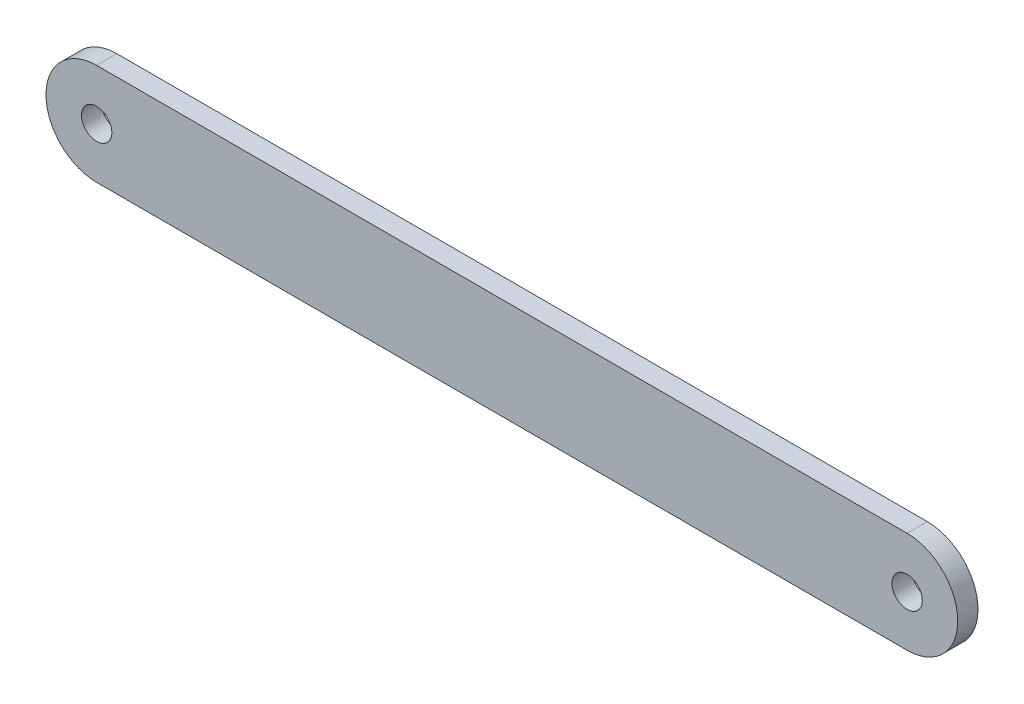
ISO-10303-21;
HEADER;
FILE_DESCRIPTION(('STEP AP214'),'2;1');
FILE_NAME('part.step','',(''),(''),'','','');
FILE_SCHEMA(('AUTOMOTIVE_DESIGN { 1 0 10303 214 1 1 1 1 }'));
ENDSEC;
DATA;
#1=APPLICATION_CONTEXT('core data for automotive mechanical design processes');
#2=APPLICATION_PROTOCOL_DEFINITION('international standard','automotive_design',2000,#1);
#3=PRODUCT_CONTEXT('',#1,'mechanical');
#4=PRODUCT('Part','Part','',(#3));
#5=PRODUCT_RELATED_PRODUCT_CATEGORY('part','',(#4));
#6=PRODUCT_DEFINITION_FORMATION('','',#4);
#7=PRODUCT_DEFINITION_CONTEXT('part definition',#1,'design');
#8=PRODUCT_DEFINITION('design','',#6,#7);
#9=PRODUCT_DEFINITION_SHAPE('','',#8);
#10=(LENGTH_UNIT() NAMED_UNIT(*) SI_UNIT(.MILLI.,.METRE.));
#11=(NAMED_UNIT(*) PLANE_ANGLE_UNIT() SI_UNIT($,.RADIAN.));
#12=(NAMED_UNIT(*) SI_UNIT($,.STERADIAN.) SOLID_ANGLE_UNIT());
#13=UNCERTAINTY_MEASURE_WITH_UNIT(LENGTH_MEASURE(1.E-05),#10,'distance_accuracy_value','');
#14=(GEOMETRIC_REPRESENTATION_CONTEXT(3) GLOBAL_UNCERTAINTY_ASSIGNED_CONTEXT((#13)) GLOBAL_UNIT_ASSIGNED_CONTEXT((#10,
#11,#12)) REPRESENTATION_CONTEXT('',''));
#15=CARTESIAN_POINT('',(0.,0.,0.));
#16=DIRECTION('',(0.,0.,1.));
#17=DIRECTION('',(1.,0.,0.));
#18=AXIS2_PLACEMENT_3D('',#15,#16,#17);
#19=CARTESIAN_POINT('',(-40.,0.,2.));
#20=DIRECTION('',(0.,0.,1.));
#21=DIRECTION('',(1.,0.,0.));
#22=AXIS2_PLACEMENT_3D('',#19,#20,#21);
#23=PLANE('',#22);
#24=CARTESIAN_POINT('',(-40.,0.,2.));
#25=DIRECTION('',(0.,0.,1.));
#26=DIRECTION('',(1.,0.,0.));
#27=AXIS2_PLACEMENT_3D('',#24,#25,#26);
#28=CIRCLE('',#27,1.5);
#29=CARTESIAN_POINT('',(-38.5,0.,2.));
#30=VERTEX_POINT('',#29);
#31=EDGE_CURVE('E99',#30,#30,#28,.T.);
#32=ORIENTED_EDGE('',*,*,#31,.F.);
#33=EDGE_LOOP('',(#32));
#34=FACE_BOUND('',#33,.T.);
#35=CARTESIAN_POINT('',(-40.,0.,2.));
#36=DIRECTION('',(0.,0.,1.));
#37=DIRECTION('',(1.,0.,0.));
#38=AXIS2_PLACEMENT_3D('',#35,#36,#37);
#39=CIRCLE('',#38,5.);
#40=CARTESIAN_POINT('',(-40.,5.,2.));
#41=VERTEX_POINT('',#40);
#42=CARTESIAN_POINT('',(-40.,-5.,2.));
#43=VERTEX_POINT('',#42);
#44=EDGE_CURVE('E84',#41,#43,#39,.T.);
#45=ORIENTED_EDGE('',*,*,#44,.T.);
#46=DIRECTION('',(1.,0.,0.));
#47=VECTOR('',#46,1.);
#48=CARTESIAN_POINT('',(-40.,-5.,2.));
#49=LINE('',#48,#47);
#50=CARTESIAN_POINT('',(40.,-4.99999999999999,2.));
#51=VERTEX_POINT('',#50);
#52=EDGE_CURVE('E79',#43,#51,#49,.T.);
#53=ORIENTED_EDGE('',*,*,#52,.T.);
#54=CARTESIAN_POINT('',(40.,0.,2.));
#55=DIRECTION('',(0.,0.,1.));
#56=DIRECTION('',(1.,0.,0.));
#57=AXIS2_PLACEMENT_3D('',#54,#55,#56);
#58=CIRCLE('',#57,5.);
#59=CARTESIAN_POINT('',(40.,5.00000000000002,2.));
#60=VERTEX_POINT('',#59);
#61=EDGE_CURVE('E82',#51,#60,#58,.T.);
#62=ORIENTED_EDGE('',*,*,#61,.T.);
#63=DIRECTION('',(-1.,0.,0.));
#64=VECTOR('',#63,1.);
#65=CARTESIAN_POINT('',(-40.,5.,2.));
#66=LINE('',#65,#64);
#67=EDGE_CURVE('E49',#60,#41,#66,.T.);
#68=ORIENTED_EDGE('',*,*,#67,.T.);
#69=EDGE_LOOP('',(#45,#53,#62,#68));
#70=FACE_BOUND('',#69,.T.);
#71=CARTESIAN_POINT('',(40.,0.,2.));
#72=DIRECTION('',(0.,0.,1.));
#73=DIRECTION('',(1.,0.,0.));
#74=AXIS2_PLACEMENT_3D('',#71,#72,#73);
#75=CIRCLE('',#74,1.5);
#76=CARTESIAN_POINT('',(41.5,0.,2.));
#77=VERTEX_POINT('',#76);
#78=EDGE_CURVE('E114',#77,#77,#75,.T.);
#79=ORIENTED_EDGE('',*,*,#78,.F.);
#80=EDGE_LOOP('',(#79));
#81=FACE_BOUND('',#80,.T.);
#82=ADVANCED_FACE('F32',(#34,#70,#81),#23,.T.);
#83=CARTESIAN_POINT('',(-40.,0.,0.));
#84=DIRECTION('',(0.,0.,1.));
#85=DIRECTION('',(1.,0.,0.));
#86=AXIS2_PLACEMENT_3D('',#83,#84,#85);
#87=PLANE('',#86);
#88=CARTESIAN_POINT('',(-40.,0.,0.));
#89=DIRECTION('',(0.,0.,1.));
#90=DIRECTION('',(1.,0.,0.));
#91=AXIS2_PLACEMENT_3D('',#88,#89,#90);
#92=CIRCLE('',#91,5.);
#93=CARTESIAN_POINT('',(-40.,5.,0.));
#94=VERTEX_POINT('',#93);
#95=CARTESIAN_POINT('',(-40.,-5.,0.));
#96=VERTEX_POINT('',#95);
#97=EDGE_CURVE('E96',#94,#96,#92,.T.);
#98=ORIENTED_EDGE('',*,*,#97,.F.);
#99=DIRECTION('',(-1.,0.,0.));
#100=VECTOR('',#99,1.);
#101=CARTESIAN_POINT('',(-40.,5.,0.));
#102=LINE('',#101,#100);
#103=CARTESIAN_POINT('',(40.,5.00000000000002,0.));
#104=VERTEX_POINT('',#103);
#105=EDGE_CURVE('E72',#104,#94,#102,.T.);
#106=ORIENTED_EDGE('',*,*,#105,.F.);
#107=CARTESIAN_POINT('',(40.,0.,0.));
#108=DIRECTION('',(0.,0.,1.));
#109=DIRECTION('',(1.,0.,0.));
#110=AXIS2_PLACEMENT_3D('',#107,#108,#109);
#111=CIRCLE('',#110,5.);
#112=CARTESIAN_POINT('',(40.,-4.99999999999999,0.));
#113=VERTEX_POINT('',#112);
#114=EDGE_CURVE('E66',#113,#104,#111,.T.);
#115=ORIENTED_EDGE('',*,*,#114,.F.);
#116=DIRECTION('',(1.,0.,0.));
#117=VECTOR('',#116,1.);
#118=CARTESIAN_POINT('',(-40.,-5.,0.));
#119=LINE('',#118,#117);
#120=EDGE_CURVE('E88',#96,#113,#119,.T.);
#121=ORIENTED_EDGE('',*,*,#120,.F.);
#122=EDGE_LOOP('',(#98,#106,#115,#121));
#123=FACE_BOUND('',#122,.T.);
#124=CARTESIAN_POINT('',(-40.,0.,0.));
#125=DIRECTION('',(0.,0.,1.));
#126=DIRECTION('',(1.,0.,0.));
#127=AXIS2_PLACEMENT_3D('',#124,#125,#126);
#128=CIRCLE('',#127,1.5);
#129=CARTESIAN_POINT('',(-38.5,0.,0.));
#130=VERTEX_POINT('',#129);
#131=EDGE_CURVE('E111',#130,#130,#128,.T.);
#132=ORIENTED_EDGE('',*,*,#131,.T.);
#133=EDGE_LOOP('',(#132));
#134=FACE_BOUND('',#133,.T.);
#135=CARTESIAN_POINT('',(40.,0.,0.));
#136=DIRECTION('',(0.,0.,1.));
#137=DIRECTION('',(1.,0.,0.));
#138=AXIS2_PLACEMENT_3D('',#135,#136,#137);
#139=CIRCLE('',#138,1.5);
#140=CARTESIAN_POINT('',(41.5,0.,0.));
#141=VERTEX_POINT('',#140);
#142=EDGE_CURVE('E117',#141,#141,#139,.T.);
#143=ORIENTED_EDGE('',*,*,#142,.T.);
#144=EDGE_LOOP('',(#143));
#145=FACE_BOUND('',#144,.T.);
#146=ADVANCED_FACE('F107',(#123,#134,#145),#87,.F.);
#147=CARTESIAN_POINT('',(-40.,0.,2.));
#148=DIRECTION('',(0.,0.,-1.));
#149=DIRECTION('',(-1.,0.,0.));
#150=AXIS2_PLACEMENT_3D('',#147,#148,#149);
#151=CYLINDRICAL_SURFACE('',#150,5.);
#152=ORIENTED_EDGE('',*,*,#97,.T.);
#153=DIRECTION('',(0.,0.,-1.));
#154=VECTOR('',#153,1.);
#155=CARTESIAN_POINT('',(-40.,-5.,2.));
#156=LINE('',#155,#154);
#157=EDGE_CURVE('E11',#43,#96,#156,.T.);
#158=ORIENTED_EDGE('',*,*,#157,.F.);
#159=ORIENTED_EDGE('',*,*,#44,.F.);
#160=DIRECTION('',(0.,0.,-1.));
#161=VECTOR('',#160,1.);
#162=CARTESIAN_POINT('',(-40.,5.,2.));
#163=LINE('',#162,#161);
#164=EDGE_CURVE('E92',#41,#94,#163,.T.);
#165=ORIENTED_EDGE('',*,*,#164,.T.);
#166=EDGE_LOOP('',(#152,#158,#159,#165));
#167=FACE_BOUND('',#166,.T.);
#168=ADVANCED_FACE('F34',(#167),#151,.T.);
#169=CARTESIAN_POINT('',(-40.,-5.,2.));
#170=DIRECTION('',(0.,1.,0.));
#171=DIRECTION('',(-1.,0.,0.));
#172=AXIS2_PLACEMENT_3D('',#169,#170,#171);
#173=PLANE('',#172);
#174=ORIENTED_EDGE('',*,*,#120,.T.);
#175=DIRECTION('',(0.,0.,-1.));
#176=VECTOR('',#175,1.);
#177=CARTESIAN_POINT('',(40.,-4.99999999999999,2.));
#178=LINE('',#177,#176);
#179=EDGE_CURVE('E41',#51,#113,#178,.T.);
#180=ORIENTED_EDGE('',*,*,#179,.F.);
#181=ORIENTED_EDGE('',*,*,#52,.F.);
#182=ORIENTED_EDGE('',*,*,#157,.T.);
#183=EDGE_LOOP('',(#174,#180,#181,#182));
#184=FACE_BOUND('',#183,.T.);
#185=ADVANCED_FACE('F87',(#184),#173,.F.);
#186=CARTESIAN_POINT('',(40.,0.,2.));
#187=DIRECTION('',(0.,0.,-1.));
#188=DIRECTION('',(-1.,0.,0.));
#189=AXIS2_PLACEMENT_3D('',#186,#187,#188);
#190=CYLINDRICAL_SURFACE('',#189,5.);
#191=ORIENTED_EDGE('',*,*,#114,.T.);
#192=DIRECTION('',(0.,0.,-1.));
#193=VECTOR('',#192,1.);
#194=CARTESIAN_POINT('',(40.,5.00000000000002,2.));
#195=LINE('',#194,#193);
#196=EDGE_CURVE('E89',#60,#104,#195,.T.);
#197=ORIENTED_EDGE('',*,*,#196,.F.);
#198=ORIENTED_EDGE('',*,*,#61,.F.);
#199=ORIENTED_EDGE('',*,*,#179,.T.);
#200=EDGE_LOOP('',(#191,#197,#198,#199));
#201=FACE_BOUND('',#200,.T.);
#202=ADVANCED_FACE('F90',(#201),#190,.T.);
#203=CARTESIAN_POINT('',(-40.,5.,2.));
#204=DIRECTION('',(0.,-1.,0.));
#205=DIRECTION('',(1.,0.,0.));
#206=AXIS2_PLACEMENT_3D('',#203,#204,#205);
#207=PLANE('',#206);
#208=ORIENTED_EDGE('',*,*,#105,.T.);
#209=ORIENTED_EDGE('',*,*,#164,.F.);
#210=ORIENTED_EDGE('',*,*,#67,.F.);
#211=ORIENTED_EDGE('',*,*,#196,.T.);
#212=EDGE_LOOP('',(#208,#209,#210,#211));
#213=FACE_BOUND('',#212,.T.);
#214=ADVANCED_FACE('F104',(#213),#207,.F.);
#215=CARTESIAN_POINT('',(-40.,0.,2.));
#216=DIRECTION('',(0.,0.,-1.));
#217=DIRECTION('',(-1.,0.,0.));
#218=AXIS2_PLACEMENT_3D('',#215,#216,#217);
#219=CYLINDRICAL_SURFACE('',#218,1.5);
#220=ORIENTED_EDGE('',*,*,#31,.T.);
#221=EDGE_LOOP('',(#220));
#222=FACE_BOUND('',#221,.T.);
#223=ORIENTED_EDGE('',*,*,#131,.F.);
#224=EDGE_LOOP('',(#223));
#225=FACE_BOUND('',#224,.T.);
#226=ADVANCED_FACE('F134',(#222,#225),#219,.F.);
#227=CARTESIAN_POINT('',(40.,0.,2.));
#228=DIRECTION('',(0.,0.,-1.));
#229=DIRECTION('',(-1.,0.,0.));
#230=AXIS2_PLACEMENT_3D('',#227,#228,#229);
#231=CYLINDRICAL_SURFACE('',#230,1.5);
#232=ORIENTED_EDGE('',*,*,#78,.T.);
#233=EDGE_LOOP('',(#232));
#234=FACE_BOUND('',#233,.T.);
#235=ORIENTED_EDGE('',*,*,#142,.F.);
#236=EDGE_LOOP('',(#235));
#237=FACE_BOUND('',#236,.T.);
#238=ADVANCED_FACE('F123',(#234,#237),#231,.F.);
#239=CLOSED_SHELL('',(#82,#146,#168,#185,#202,#214,#226,#238));
#240=MANIFOLD_SOLID_BREP('B2',#239);
#241=ADVANCED_BREP_SHAPE_REPRESENTATION('',(#18,#240),#14);
#242=SHAPE_DEFINITION_REPRESENTATION(#9,#241);
ENDSEC;
END-ISO-10303-21;
